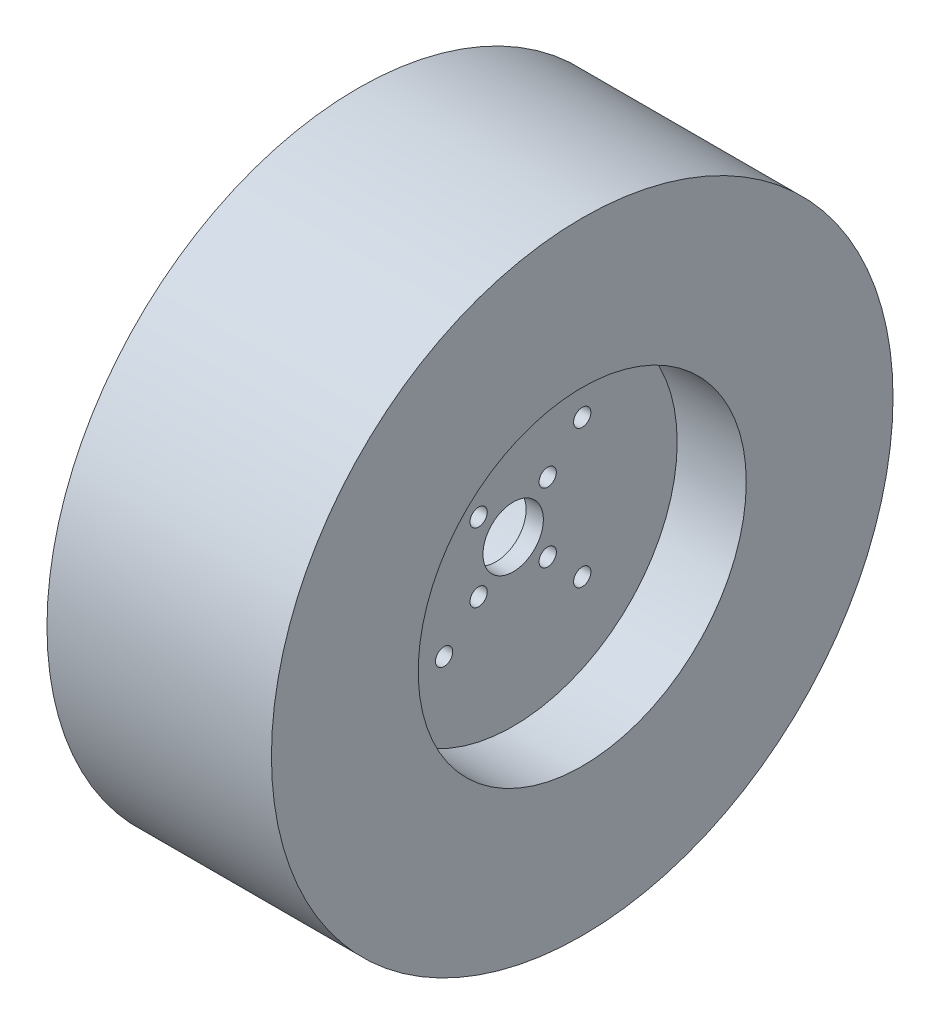
ISO-10303-21;
HEADER;
FILE_DESCRIPTION(('STEP AP214'),'2;1');
FILE_NAME('part.step','',(''),(''),'','','');
FILE_SCHEMA(('AUTOMOTIVE_DESIGN { 1 0 10303 214 1 1 1 1 }'));
ENDSEC;
DATA;
#1=APPLICATION_CONTEXT('core data for automotive mechanical design processes');
#2=APPLICATION_PROTOCOL_DEFINITION('international standard','automotive_design',2000,#1);
#3=PRODUCT_CONTEXT('',#1,'mechanical');
#4=PRODUCT('Part','Part','',(#3));
#5=PRODUCT_RELATED_PRODUCT_CATEGORY('part','',(#4));
#6=PRODUCT_DEFINITION_FORMATION('','',#4);
#7=PRODUCT_DEFINITION_CONTEXT('part definition',#1,'design');
#8=PRODUCT_DEFINITION('design','',#6,#7);
#9=PRODUCT_DEFINITION_SHAPE('','',#8);
#10=(LENGTH_UNIT() NAMED_UNIT(*) SI_UNIT(.MILLI.,.METRE.));
#11=(NAMED_UNIT(*) PLANE_ANGLE_UNIT() SI_UNIT($,.RADIAN.));
#12=(NAMED_UNIT(*) SI_UNIT($,.STERADIAN.) SOLID_ANGLE_UNIT());
#13=UNCERTAINTY_MEASURE_WITH_UNIT(LENGTH_MEASURE(1.E-05),#10,'distance_accuracy_value','');
#14=(GEOMETRIC_REPRESENTATION_CONTEXT(3) GLOBAL_UNCERTAINTY_ASSIGNED_CONTEXT((#13)) GLOBAL_UNIT_ASSIGNED_CONTEXT((#10,
#11,#12)) REPRESENTATION_CONTEXT('',''));
#15=CARTESIAN_POINT('',(0.,0.,0.));
#16=DIRECTION('',(0.,0.,1.));
#17=DIRECTION('',(1.,0.,0.));
#18=AXIS2_PLACEMENT_3D('',#15,#16,#17);
#19=CARTESIAN_POINT('',(20.,0.,0.));
#20=DIRECTION('',(-1.,0.,0.));
#21=DIRECTION('',(0.,0.,1.));
#22=AXIS2_PLACEMENT_3D('',#19,#20,#21);
#23=CYLINDRICAL_SURFACE('',#22,72.);
#24=CARTESIAN_POINT('',(20.,0.,0.));
#25=DIRECTION('',(1.,0.,0.));
#26=DIRECTION('',(0.,0.,-1.));
#27=AXIS2_PLACEMENT_3D('',#24,#25,#26);
#28=CIRCLE('',#27,72.);
#29=CARTESIAN_POINT('',(20.,0.,-72.));
#30=VERTEX_POINT('',#29);
#31=EDGE_CURVE('E10',#30,#30,#28,.T.);
#32=ORIENTED_EDGE('',*,*,#31,.F.);
#33=EDGE_LOOP('',(#32));
#34=FACE_BOUND('',#33,.T.);
#35=CARTESIAN_POINT('',(-32.,0.,0.));
#36=DIRECTION('',(1.,0.,0.));
#37=DIRECTION('',(0.,0.,-1.));
#38=AXIS2_PLACEMENT_3D('',#35,#36,#37);
#39=CIRCLE('',#38,72.);
#40=CARTESIAN_POINT('',(-32.,0.,-72.));
#41=VERTEX_POINT('',#40);
#42=EDGE_CURVE('E37',#41,#41,#39,.T.);
#43=ORIENTED_EDGE('',*,*,#42,.T.);
#44=EDGE_LOOP('',(#43));
#45=FACE_BOUND('',#44,.T.);
#46=ADVANCED_FACE('F40',(#34,#45),#23,.T.);
#47=CARTESIAN_POINT('',(20.,0.,0.));
#48=DIRECTION('',(1.,0.,0.));
#49=DIRECTION('',(0.,0.,-1.));
#50=AXIS2_PLACEMENT_3D('',#47,#48,#49);
#51=PLANE('',#50);
#52=CARTESIAN_POINT('',(20.,0.,0.));
#53=DIRECTION('',(1.,0.,0.));
#54=DIRECTION('',(0.,0.,-1.));
#55=AXIS2_PLACEMENT_3D('',#52,#53,#54);
#56=CIRCLE('',#55,38.);
#57=CARTESIAN_POINT('',(20.,0.,-38.));
#58=VERTEX_POINT('',#57);
#59=EDGE_CURVE('E54',#58,#58,#56,.T.);
#60=ORIENTED_EDGE('',*,*,#59,.F.);
#61=EDGE_LOOP('',(#60));
#62=FACE_BOUND('',#61,.T.);
#63=ORIENTED_EDGE('',*,*,#31,.T.);
#64=EDGE_LOOP('',(#63));
#65=FACE_BOUND('',#64,.T.);
#66=ADVANCED_FACE('F133',(#62,#65),#51,.T.);
#67=CARTESIAN_POINT('',(-32.,0.,0.));
#68=DIRECTION('',(1.,0.,0.));
#69=DIRECTION('',(0.,0.,-1.));
#70=AXIS2_PLACEMENT_3D('',#67,#68,#69);
#71=PLANE('',#70);
#72=CARTESIAN_POINT('',(-32.,0.,0.));
#73=DIRECTION('',(1.,0.,0.));
#74=DIRECTION('',(0.,0.,-1.));
#75=AXIS2_PLACEMENT_3D('',#72,#73,#74);
#76=CIRCLE('',#75,38.);
#77=CARTESIAN_POINT('',(-32.,0.,-38.));
#78=VERTEX_POINT('',#77);
#79=EDGE_CURVE('E47',#78,#78,#76,.T.);
#80=ORIENTED_EDGE('',*,*,#79,.T.);
#81=EDGE_LOOP('',(#80));
#82=FACE_BOUND('',#81,.T.);
#83=ORIENTED_EDGE('',*,*,#42,.F.);
#84=EDGE_LOOP('',(#83));
#85=FACE_BOUND('',#84,.T.);
#86=ADVANCED_FACE('F142',(#82,#85),#71,.F.);
#87=CARTESIAN_POINT('',(0.,0.,0.));
#88=DIRECTION('',(-1.,0.,0.));
#89=DIRECTION('',(0.,0.,1.));
#90=AXIS2_PLACEMENT_3D('',#87,#88,#89);
#91=CYLINDRICAL_SURFACE('',#90,38.);
#92=CARTESIAN_POINT('',(0.,0.,0.));
#93=DIRECTION('',(1.,0.,0.));
#94=DIRECTION('',(0.,0.,-1.));
#95=AXIS2_PLACEMENT_3D('',#92,#93,#94);
#96=CIRCLE('',#95,38.);
#97=CARTESIAN_POINT('',(0.,0.,-38.));
#98=VERTEX_POINT('',#97);
#99=EDGE_CURVE('E50',#98,#98,#96,.T.);
#100=ORIENTED_EDGE('',*,*,#99,.T.);
#101=EDGE_LOOP('',(#100));
#102=FACE_BOUND('',#101,.T.);
#103=ORIENTED_EDGE('',*,*,#79,.F.);
#104=EDGE_LOOP('',(#103));
#105=FACE_BOUND('',#104,.T.);
#106=ADVANCED_FACE('F150',(#102,#105),#91,.F.);
#107=CARTESIAN_POINT('',(0.,0.,0.));
#108=DIRECTION('',(1.,0.,0.));
#109=DIRECTION('',(0.,0.,-1.));
#110=AXIS2_PLACEMENT_3D('',#107,#108,#109);
#111=PLANE('',#110);
#112=CARTESIAN_POINT('',(0.,8.,8.));
#113=DIRECTION('',(1.,0.,0.));
#114=DIRECTION('',(0.,0.,-1.));
#115=AXIS2_PLACEMENT_3D('',#112,#113,#114);
#116=CIRCLE('',#115,2.);
#117=CARTESIAN_POINT('',(0.,8.,6.));
#118=VERTEX_POINT('',#117);
#119=EDGE_CURVE('E61',#118,#118,#116,.T.);
#120=ORIENTED_EDGE('',*,*,#119,.T.);
#121=EDGE_LOOP('',(#120));
#122=FACE_BOUND('',#121,.T.);
#123=CARTESIAN_POINT('',(0.,-8.,8.));
#124=DIRECTION('',(1.,0.,0.));
#125=DIRECTION('',(0.,0.,-1.));
#126=AXIS2_PLACEMENT_3D('',#123,#124,#125);
#127=CIRCLE('',#126,2.);
#128=CARTESIAN_POINT('',(0.,-8.,6.));
#129=VERTEX_POINT('',#128);
#130=EDGE_CURVE('E84',#129,#129,#127,.T.);
#131=ORIENTED_EDGE('',*,*,#130,.T.);
#132=EDGE_LOOP('',(#131));
#133=FACE_BOUND('',#132,.T.);
#134=CARTESIAN_POINT('',(0.,8.,-8.));
#135=DIRECTION('',(1.,0.,0.));
#136=DIRECTION('',(0.,0.,-1.));
#137=AXIS2_PLACEMENT_3D('',#134,#135,#136);
#138=CIRCLE('',#137,2.);
#139=CARTESIAN_POINT('',(0.,8.,-10.));
#140=VERTEX_POINT('',#139);
#141=EDGE_CURVE('E80',#140,#140,#138,.T.);
#142=ORIENTED_EDGE('',*,*,#141,.T.);
#143=EDGE_LOOP('',(#142));
#144=FACE_BOUND('',#143,.T.);
#145=CARTESIAN_POINT('',(0.,-8.,-8.));
#146=DIRECTION('',(1.,0.,0.));
#147=DIRECTION('',(0.,0.,-1.));
#148=AXIS2_PLACEMENT_3D('',#145,#146,#147);
#149=CIRCLE('',#148,2.);
#150=CARTESIAN_POINT('',(0.,-8.,-10.));
#151=VERTEX_POINT('',#150);
#152=EDGE_CURVE('E68',#151,#151,#149,.T.);
#153=ORIENTED_EDGE('',*,*,#152,.T.);
#154=EDGE_LOOP('',(#153));
#155=FACE_BOUND('',#154,.T.);
#156=CARTESIAN_POINT('',(0.,16.,16.));
#157=DIRECTION('',(1.,0.,0.));
#158=DIRECTION('',(0.,0.,-1.));
#159=AXIS2_PLACEMENT_3D('',#156,#157,#158);
#160=CIRCLE('',#159,2.);
#161=CARTESIAN_POINT('',(0.,16.,14.));
#162=VERTEX_POINT('',#161);
#163=EDGE_CURVE('E72',#162,#162,#160,.T.);
#164=ORIENTED_EDGE('',*,*,#163,.T.);
#165=EDGE_LOOP('',(#164));
#166=FACE_BOUND('',#165,.T.);
#167=CARTESIAN_POINT('',(0.,-16.,16.));
#168=DIRECTION('',(1.,0.,0.));
#169=DIRECTION('',(0.,0.,-1.));
#170=AXIS2_PLACEMENT_3D('',#167,#168,#169);
#171=CIRCLE('',#170,2.);
#172=CARTESIAN_POINT('',(0.,-16.,14.));
#173=VERTEX_POINT('',#172);
#174=EDGE_CURVE('E106',#173,#173,#171,.T.);
#175=ORIENTED_EDGE('',*,*,#174,.T.);
#176=EDGE_LOOP('',(#175));
#177=FACE_BOUND('',#176,.T.);
#178=CARTESIAN_POINT('',(0.,16.,-16.));
#179=DIRECTION('',(1.,0.,0.));
#180=DIRECTION('',(0.,0.,-1.));
#181=AXIS2_PLACEMENT_3D('',#178,#179,#180);
#182=CIRCLE('',#181,2.);
#183=CARTESIAN_POINT('',(0.,16.,-18.));
#184=VERTEX_POINT('',#183);
#185=EDGE_CURVE('E99',#184,#184,#182,.T.);
#186=ORIENTED_EDGE('',*,*,#185,.T.);
#187=EDGE_LOOP('',(#186));
#188=FACE_BOUND('',#187,.T.);
#189=CARTESIAN_POINT('',(0.,-16.,-16.));
#190=DIRECTION('',(1.,0.,0.));
#191=DIRECTION('',(0.,0.,-1.));
#192=AXIS2_PLACEMENT_3D('',#189,#190,#191);
#193=CIRCLE('',#192,2.);
#194=CARTESIAN_POINT('',(0.,-16.,-18.));
#195=VERTEX_POINT('',#194);
#196=EDGE_CURVE('E94',#195,#195,#193,.T.);
#197=ORIENTED_EDGE('',*,*,#196,.T.);
#198=EDGE_LOOP('',(#197));
#199=FACE_BOUND('',#198,.T.);
#200=CARTESIAN_POINT('',(0.,0.,0.));
#201=DIRECTION('',(1.,0.,0.));
#202=DIRECTION('',(0.,0.,-1.));
#203=AXIS2_PLACEMENT_3D('',#200,#201,#202);
#204=CIRCLE('',#203,7.);
#205=CARTESIAN_POINT('',(0.,0.,-7.));
#206=VERTEX_POINT('',#205);
#207=EDGE_CURVE('E62',#206,#206,#204,.T.);
#208=ORIENTED_EDGE('',*,*,#207,.T.);
#209=EDGE_LOOP('',(#208));
#210=FACE_BOUND('',#209,.T.);
#211=ORIENTED_EDGE('',*,*,#99,.F.);
#212=EDGE_LOOP('',(#211));
#213=FACE_BOUND('',#212,.T.);
#214=ADVANCED_FACE('F114',(#122,#133,#144,#155,#166,#177,#188,#199,#210,#213),#111,.F.);
#215=CARTESIAN_POINT('',(4.,0.,0.));
#216=DIRECTION('',(1.,0.,0.));
#217=DIRECTION('',(0.,0.,-1.));
#218=AXIS2_PLACEMENT_3D('',#215,#216,#217);
#219=CYLINDRICAL_SURFACE('',#218,38.);
#220=CARTESIAN_POINT('',(4.,0.,0.));
#221=DIRECTION('',(1.,0.,0.));
#222=DIRECTION('',(0.,0.,-1.));
#223=AXIS2_PLACEMENT_3D('',#220,#221,#222);
#224=CIRCLE('',#223,38.);
#225=CARTESIAN_POINT('',(4.,0.,-38.));
#226=VERTEX_POINT('',#225);
#227=EDGE_CURVE('E55',#226,#226,#224,.T.);
#228=ORIENTED_EDGE('',*,*,#227,.F.);
#229=EDGE_LOOP('',(#228));
#230=FACE_BOUND('',#229,.T.);
#231=ORIENTED_EDGE('',*,*,#59,.T.);
#232=EDGE_LOOP('',(#231));
#233=FACE_BOUND('',#232,.T.);
#234=ADVANCED_FACE('F160',(#230,#233),#219,.F.);
#235=CARTESIAN_POINT('',(4.,0.,0.));
#236=DIRECTION('',(1.,0.,0.));
#237=DIRECTION('',(0.,0.,-1.));
#238=AXIS2_PLACEMENT_3D('',#235,#236,#237);
#239=PLANE('',#238);
#240=CARTESIAN_POINT('',(4.,8.,8.));
#241=DIRECTION('',(1.,0.,0.));
#242=DIRECTION('',(0.,0.,-1.));
#243=AXIS2_PLACEMENT_3D('',#240,#241,#242);
#244=CIRCLE('',#243,2.);
#245=CARTESIAN_POINT('',(4.,8.,6.));
#246=VERTEX_POINT('',#245);
#247=EDGE_CURVE('E87',#246,#246,#244,.T.);
#248=ORIENTED_EDGE('',*,*,#247,.F.);
#249=EDGE_LOOP('',(#248));
#250=FACE_BOUND('',#249,.T.);
#251=CARTESIAN_POINT('',(4.,-8.,8.));
#252=DIRECTION('',(1.,0.,0.));
#253=DIRECTION('',(0.,0.,-1.));
#254=AXIS2_PLACEMENT_3D('',#251,#252,#253);
#255=CIRCLE('',#254,2.);
#256=CARTESIAN_POINT('',(4.,-8.,6.));
#257=VERTEX_POINT('',#256);
#258=EDGE_CURVE('E78',#257,#257,#255,.T.);
#259=ORIENTED_EDGE('',*,*,#258,.F.);
#260=EDGE_LOOP('',(#259));
#261=FACE_BOUND('',#260,.T.);
#262=CARTESIAN_POINT('',(4.,8.,-8.));
#263=DIRECTION('',(1.,0.,0.));
#264=DIRECTION('',(0.,0.,-1.));
#265=AXIS2_PLACEMENT_3D('',#262,#263,#264);
#266=CIRCLE('',#265,2.);
#267=CARTESIAN_POINT('',(4.,8.,-10.));
#268=VERTEX_POINT('',#267);
#269=EDGE_CURVE('E74',#268,#268,#266,.T.);
#270=ORIENTED_EDGE('',*,*,#269,.F.);
#271=EDGE_LOOP('',(#270));
#272=FACE_BOUND('',#271,.T.);
#273=CARTESIAN_POINT('',(4.,-8.,-8.));
#274=DIRECTION('',(1.,0.,0.));
#275=DIRECTION('',(0.,0.,-1.));
#276=AXIS2_PLACEMENT_3D('',#273,#274,#275);
#277=CIRCLE('',#276,2.);
#278=CARTESIAN_POINT('',(4.,-8.,-10.));
#279=VERTEX_POINT('',#278);
#280=EDGE_CURVE('E70',#279,#279,#277,.T.);
#281=ORIENTED_EDGE('',*,*,#280,.F.);
#282=EDGE_LOOP('',(#281));
#283=FACE_BOUND('',#282,.T.);
#284=CARTESIAN_POINT('',(4.,16.,16.));
#285=DIRECTION('',(1.,0.,0.));
#286=DIRECTION('',(0.,0.,-1.));
#287=AXIS2_PLACEMENT_3D('',#284,#285,#286);
#288=CIRCLE('',#287,2.);
#289=CARTESIAN_POINT('',(4.,16.,14.));
#290=VERTEX_POINT('',#289);
#291=EDGE_CURVE('E107',#290,#290,#288,.T.);
#292=ORIENTED_EDGE('',*,*,#291,.F.);
#293=EDGE_LOOP('',(#292));
#294=FACE_BOUND('',#293,.T.);
#295=CARTESIAN_POINT('',(4.,-16.,16.));
#296=DIRECTION('',(1.,0.,0.));
#297=DIRECTION('',(0.,0.,-1.));
#298=AXIS2_PLACEMENT_3D('',#295,#296,#297);
#299=CIRCLE('',#298,2.);
#300=CARTESIAN_POINT('',(4.,-16.,14.));
#301=VERTEX_POINT('',#300);
#302=EDGE_CURVE('E101',#301,#301,#299,.T.);
#303=ORIENTED_EDGE('',*,*,#302,.F.);
#304=EDGE_LOOP('',(#303));
#305=FACE_BOUND('',#304,.T.);
#306=CARTESIAN_POINT('',(4.,16.,-16.));
#307=DIRECTION('',(1.,0.,0.));
#308=DIRECTION('',(0.,0.,-1.));
#309=AXIS2_PLACEMENT_3D('',#306,#307,#308);
#310=CIRCLE('',#309,2.);
#311=CARTESIAN_POINT('',(4.,16.,-18.));
#312=VERTEX_POINT('',#311);
#313=EDGE_CURVE('E97',#312,#312,#310,.T.);
#314=ORIENTED_EDGE('',*,*,#313,.F.);
#315=EDGE_LOOP('',(#314));
#316=FACE_BOUND('',#315,.T.);
#317=CARTESIAN_POINT('',(4.,-16.,-16.));
#318=DIRECTION('',(1.,0.,0.));
#319=DIRECTION('',(0.,0.,-1.));
#320=AXIS2_PLACEMENT_3D('',#317,#318,#319);
#321=CIRCLE('',#320,2.);
#322=CARTESIAN_POINT('',(4.,-16.,-18.));
#323=VERTEX_POINT('',#322);
#324=EDGE_CURVE('E92',#323,#323,#321,.T.);
#325=ORIENTED_EDGE('',*,*,#324,.F.);
#326=EDGE_LOOP('',(#325));
#327=FACE_BOUND('',#326,.T.);
#328=CARTESIAN_POINT('',(4.,0.,0.));
#329=DIRECTION('',(1.,0.,0.));
#330=DIRECTION('',(0.,0.,-1.));
#331=AXIS2_PLACEMENT_3D('',#328,#329,#330);
#332=CIRCLE('',#331,7.);
#333=CARTESIAN_POINT('',(4.,0.,-7.));
#334=VERTEX_POINT('',#333);
#335=EDGE_CURVE('E59',#334,#334,#332,.T.);
#336=ORIENTED_EDGE('',*,*,#335,.F.);
#337=EDGE_LOOP('',(#336));
#338=FACE_BOUND('',#337,.T.);
#339=ORIENTED_EDGE('',*,*,#227,.T.);
#340=EDGE_LOOP('',(#339));
#341=FACE_BOUND('',#340,.T.);
#342=ADVANCED_FACE('F163',(#250,#261,#272,#283,#294,#305,#316,#327,#338,#341),#239,.T.);
#343=CARTESIAN_POINT('',(4.,0.,0.));
#344=DIRECTION('',(-1.,0.,0.));
#345=DIRECTION('',(0.,0.,1.));
#346=AXIS2_PLACEMENT_3D('',#343,#344,#345);
#347=CYLINDRICAL_SURFACE('',#346,7.);
#348=ORIENTED_EDGE('',*,*,#335,.T.);
#349=EDGE_LOOP('',(#348));
#350=FACE_BOUND('',#349,.T.);
#351=ORIENTED_EDGE('',*,*,#207,.F.);
#352=EDGE_LOOP('',(#351));
#353=FACE_BOUND('',#352,.T.);
#354=ADVANCED_FACE('F164',(#350,#353),#347,.F.);
#355=CARTESIAN_POINT('',(4.,-16.,-16.));
#356=DIRECTION('',(-1.,0.,0.));
#357=DIRECTION('',(0.,0.,1.));
#358=AXIS2_PLACEMENT_3D('',#355,#356,#357);
#359=CYLINDRICAL_SURFACE('',#358,2.);
#360=ORIENTED_EDGE('',*,*,#324,.T.);
#361=EDGE_LOOP('',(#360));
#362=FACE_BOUND('',#361,.T.);
#363=ORIENTED_EDGE('',*,*,#196,.F.);
#364=EDGE_LOOP('',(#363));
#365=FACE_BOUND('',#364,.T.);
#366=ADVANCED_FACE('F166',(#362,#365),#359,.F.);
#367=CARTESIAN_POINT('',(4.,16.,-16.));
#368=DIRECTION('',(-1.,0.,0.));
#369=DIRECTION('',(0.,0.,1.));
#370=AXIS2_PLACEMENT_3D('',#367,#368,#369);
#371=CYLINDRICAL_SURFACE('',#370,2.);
#372=ORIENTED_EDGE('',*,*,#313,.T.);
#373=EDGE_LOOP('',(#372));
#374=FACE_BOUND('',#373,.T.);
#375=ORIENTED_EDGE('',*,*,#185,.F.);
#376=EDGE_LOOP('',(#375));
#377=FACE_BOUND('',#376,.T.);
#378=ADVANCED_FACE('F132',(#374,#377),#371,.F.);
#379=CARTESIAN_POINT('',(4.,-16.,16.));
#380=DIRECTION('',(-1.,0.,0.));
#381=DIRECTION('',(0.,0.,1.));
#382=AXIS2_PLACEMENT_3D('',#379,#380,#381);
#383=CYLINDRICAL_SURFACE('',#382,2.);
#384=ORIENTED_EDGE('',*,*,#302,.T.);
#385=EDGE_LOOP('',(#384));
#386=FACE_BOUND('',#385,.T.);
#387=ORIENTED_EDGE('',*,*,#174,.F.);
#388=EDGE_LOOP('',(#387));
#389=FACE_BOUND('',#388,.T.);
#390=ADVANCED_FACE('F122',(#386,#389),#383,.F.);
#391=CARTESIAN_POINT('',(4.,16.,16.));
#392=DIRECTION('',(-1.,0.,0.));
#393=DIRECTION('',(0.,0.,1.));
#394=AXIS2_PLACEMENT_3D('',#391,#392,#393);
#395=CYLINDRICAL_SURFACE('',#394,2.);
#396=ORIENTED_EDGE('',*,*,#291,.T.);
#397=EDGE_LOOP('',(#396));
#398=FACE_BOUND('',#397,.T.);
#399=ORIENTED_EDGE('',*,*,#163,.F.);
#400=EDGE_LOOP('',(#399));
#401=FACE_BOUND('',#400,.T.);
#402=ADVANCED_FACE('F117',(#398,#401),#395,.F.);
#403=CARTESIAN_POINT('',(4.,-8.,-8.));
#404=DIRECTION('',(-1.,0.,0.));
#405=DIRECTION('',(0.,0.,1.));
#406=AXIS2_PLACEMENT_3D('',#403,#404,#405);
#407=CYLINDRICAL_SURFACE('',#406,2.);
#408=ORIENTED_EDGE('',*,*,#280,.T.);
#409=EDGE_LOOP('',(#408));
#410=FACE_BOUND('',#409,.T.);
#411=ORIENTED_EDGE('',*,*,#152,.F.);
#412=EDGE_LOOP('',(#411));
#413=FACE_BOUND('',#412,.T.);
#414=ADVANCED_FACE('F119',(#410,#413),#407,.F.);
#415=CARTESIAN_POINT('',(4.,8.,-8.));
#416=DIRECTION('',(-1.,0.,0.));
#417=DIRECTION('',(0.,0.,1.));
#418=AXIS2_PLACEMENT_3D('',#415,#416,#417);
#419=CYLINDRICAL_SURFACE('',#418,2.);
#420=ORIENTED_EDGE('',*,*,#269,.T.);
#421=EDGE_LOOP('',(#420));
#422=FACE_BOUND('',#421,.T.);
#423=ORIENTED_EDGE('',*,*,#141,.F.);
#424=EDGE_LOOP('',(#423));
#425=FACE_BOUND('',#424,.T.);
#426=ADVANCED_FACE('F129',(#422,#425),#419,.F.);
#427=CARTESIAN_POINT('',(4.,-8.,8.));
#428=DIRECTION('',(-1.,0.,0.));
#429=DIRECTION('',(0.,0.,1.));
#430=AXIS2_PLACEMENT_3D('',#427,#428,#429);
#431=CYLINDRICAL_SURFACE('',#430,2.);
#432=ORIENTED_EDGE('',*,*,#258,.T.);
#433=EDGE_LOOP('',(#432));
#434=FACE_BOUND('',#433,.T.);
#435=ORIENTED_EDGE('',*,*,#130,.F.);
#436=EDGE_LOOP('',(#435));
#437=FACE_BOUND('',#436,.T.);
#438=ADVANCED_FACE('F173',(#434,#437),#431,.F.);
#439=CARTESIAN_POINT('',(4.,8.,8.));
#440=DIRECTION('',(-1.,0.,0.));
#441=DIRECTION('',(0.,0.,1.));
#442=AXIS2_PLACEMENT_3D('',#439,#440,#441);
#443=CYLINDRICAL_SURFACE('',#442,2.);
#444=ORIENTED_EDGE('',*,*,#247,.T.);
#445=EDGE_LOOP('',(#444));
#446=FACE_BOUND('',#445,.T.);
#447=ORIENTED_EDGE('',*,*,#119,.F.);
#448=EDGE_LOOP('',(#447));
#449=FACE_BOUND('',#448,.T.);
#450=ADVANCED_FACE('F180',(#446,#449),#443,.F.);
#451=CLOSED_SHELL('',(#46,#66,#86,#106,#214,#234,#342,#354,#366,#378,#390,#402,#414,#426,#438,#450));
#452=MANIFOLD_SOLID_BREP('B2',#451);
#453=ADVANCED_BREP_SHAPE_REPRESENTATION('',(#18,#452),#14);
#454=SHAPE_DEFINITION_REPRESENTATION(#9,#453);
ENDSEC;
END-ISO-10303-21;
